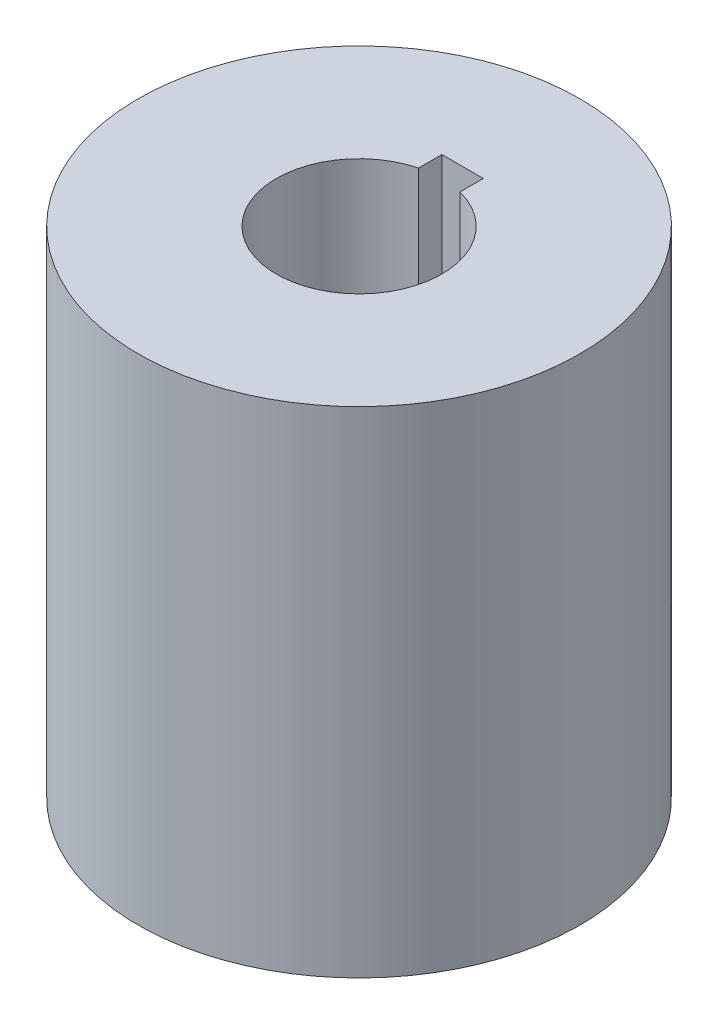
ISO-10303-21;
HEADER;
FILE_DESCRIPTION(('STEP AP214'),'2;1');
FILE_NAME('part.step','',(''),(''),'','','');
FILE_SCHEMA(('AUTOMOTIVE_DESIGN { 1 0 10303 214 1 1 1 1 }'));
ENDSEC;
DATA;
#1=APPLICATION_CONTEXT('core data for automotive mechanical design processes');
#2=APPLICATION_PROTOCOL_DEFINITION('international standard','automotive_design',2000,#1);
#3=PRODUCT_CONTEXT('',#1,'mechanical');
#4=PRODUCT('Part','Part','',(#3));
#5=PRODUCT_RELATED_PRODUCT_CATEGORY('part','',(#4));
#6=PRODUCT_DEFINITION_FORMATION('','',#4);
#7=PRODUCT_DEFINITION_CONTEXT('part definition',#1,'design');
#8=PRODUCT_DEFINITION('design','',#6,#7);
#9=PRODUCT_DEFINITION_SHAPE('','',#8);
#10=(LENGTH_UNIT() NAMED_UNIT(*) SI_UNIT(.MILLI.,.METRE.));
#11=(NAMED_UNIT(*) PLANE_ANGLE_UNIT() SI_UNIT($,.RADIAN.));
#12=(NAMED_UNIT(*) SI_UNIT($,.STERADIAN.) SOLID_ANGLE_UNIT());
#13=UNCERTAINTY_MEASURE_WITH_UNIT(LENGTH_MEASURE(1.E-05),#10,'distance_accuracy_value','');
#14=(GEOMETRIC_REPRESENTATION_CONTEXT(3) GLOBAL_UNCERTAINTY_ASSIGNED_CONTEXT((#13)) GLOBAL_UNIT_ASSIGNED_CONTEXT((#10,
#11,#12)) REPRESENTATION_CONTEXT('',''));
#15=CARTESIAN_POINT('',(0.,0.,0.));
#16=DIRECTION('',(0.,0.,1.));
#17=DIRECTION('',(1.,0.,0.));
#18=AXIS2_PLACEMENT_3D('',#15,#16,#17);
#19=CARTESIAN_POINT('',(1.190625,28.448,-5.953125));
#20=DIRECTION('',(-1.,0.,0.));
#21=DIRECTION('',(0.,0.,1.));
#22=AXIS2_PLACEMENT_3D('',#19,#20,#21);
#23=PLANE('',#22);
#24=DIRECTION('',(0.,0.,1.));
#25=VECTOR('',#24,1.);
#26=CARTESIAN_POINT('',(1.190625,28.448,-5.953125));
#27=LINE('',#26,#25);
#28=CARTESIAN_POINT('',(1.190625,28.448,-4.61127079657821));
#29=VERTEX_POINT('',#28);
#30=CARTESIAN_POINT('',(1.190625,28.448,-5.953125));
#31=VERTEX_POINT('',#30);
#32=EDGE_CURVE('E47',#29,#31,#27,.F.);
#33=ORIENTED_EDGE('',*,*,#32,.T.);
#34=DIRECTION('',(0.,1.,0.));
#35=VECTOR('',#34,1.);
#36=CARTESIAN_POINT('',(1.190625,28.448,-5.953125));
#37=LINE('',#36,#35);
#38=CARTESIAN_POINT('',(1.190625,0.,-5.953125));
#39=VERTEX_POINT('',#38);
#40=EDGE_CURVE('E74',#39,#31,#37,.T.);
#41=ORIENTED_EDGE('',*,*,#40,.F.);
#42=DIRECTION('',(0.,0.,1.));
#43=VECTOR('',#42,1.);
#44=CARTESIAN_POINT('',(1.190625,0.,-5.953125));
#45=LINE('',#44,#43);
#46=CARTESIAN_POINT('',(1.190625,0.,-4.61127079657821));
#47=VERTEX_POINT('',#46);
#48=EDGE_CURVE('E62',#39,#47,#45,.T.);
#49=ORIENTED_EDGE('',*,*,#48,.T.);
#50=DIRECTION('',(0.,-1.,0.));
#51=VECTOR('',#50,1.);
#52=CARTESIAN_POINT('',(1.190625,28.448,-4.61127079657821));
#53=LINE('',#52,#51);
#54=EDGE_CURVE('E166',#47,#29,#53,.F.);
#55=ORIENTED_EDGE('',*,*,#54,.T.);
#56=EDGE_LOOP('',(#33,#41,#49,#55));
#57=FACE_BOUND('',#56,.T.);
#58=ADVANCED_FACE('F17',(#57),#23,.T.);
#59=CARTESIAN_POINT('',(-1.190625,28.448,-5.953125));
#60=DIRECTION('',(1.,0.,0.));
#61=DIRECTION('',(0.,0.,-1.));
#62=AXIS2_PLACEMENT_3D('',#59,#60,#61);
#63=PLANE('',#62);
#64=DIRECTION('',(0.,0.,-1.));
#65=VECTOR('',#64,1.);
#66=CARTESIAN_POINT('',(-1.190625,28.448,-5.953125));
#67=LINE('',#66,#65);
#68=CARTESIAN_POINT('',(-1.190625,28.448,-5.953125));
#69=VERTEX_POINT('',#68);
#70=CARTESIAN_POINT('',(-1.190625,28.448,-4.61127079657821));
#71=VERTEX_POINT('',#70);
#72=EDGE_CURVE('E54',#69,#71,#67,.F.);
#73=ORIENTED_EDGE('',*,*,#72,.T.);
#74=DIRECTION('',(0.,-1.,0.));
#75=VECTOR('',#74,1.);
#76=CARTESIAN_POINT('',(-1.190625,28.448,-4.61127079657821));
#77=LINE('',#76,#75);
#78=CARTESIAN_POINT('',(-1.190625,0.,-4.61127079657821));
#79=VERTEX_POINT('',#78);
#80=EDGE_CURVE('E165',#71,#79,#77,.T.);
#81=ORIENTED_EDGE('',*,*,#80,.T.);
#82=DIRECTION('',(0.,0.,-1.));
#83=VECTOR('',#82,1.);
#84=CARTESIAN_POINT('',(-1.190625,0.,-5.953125));
#85=LINE('',#84,#83);
#86=CARTESIAN_POINT('',(-1.190625,0.,-5.953125));
#87=VERTEX_POINT('',#86);
#88=EDGE_CURVE('E35',#79,#87,#85,.T.);
#89=ORIENTED_EDGE('',*,*,#88,.T.);
#90=DIRECTION('',(0.,1.,0.));
#91=VECTOR('',#90,1.);
#92=CARTESIAN_POINT('',(-1.190625,28.448,-5.953125));
#93=LINE('',#92,#91);
#94=EDGE_CURVE('E77',#69,#87,#93,.F.);
#95=ORIENTED_EDGE('',*,*,#94,.F.);
#96=EDGE_LOOP('',(#73,#81,#89,#95));
#97=FACE_BOUND('',#96,.T.);
#98=ADVANCED_FACE('F142',(#97),#63,.T.);
#99=CARTESIAN_POINT('',(-1.190625,28.448,-5.953125));
#100=DIRECTION('',(0.,0.,1.));
#101=DIRECTION('',(1.,0.,0.));
#102=AXIS2_PLACEMENT_3D('',#99,#100,#101);
#103=PLANE('',#102);
#104=DIRECTION('',(1.,0.,0.));
#105=VECTOR('',#104,1.);
#106=CARTESIAN_POINT('',(0.,28.448,-5.953125));
#107=LINE('',#106,#105);
#108=EDGE_CURVE('E81',#69,#31,#107,.T.);
#109=ORIENTED_EDGE('',*,*,#108,.F.);
#110=ORIENTED_EDGE('',*,*,#94,.T.);
#111=DIRECTION('',(1.,0.,0.));
#112=VECTOR('',#111,1.);
#113=CARTESIAN_POINT('',(0.,0.,-5.953125));
#114=LINE('',#113,#112);
#115=EDGE_CURVE('E67',#87,#39,#114,.T.);
#116=ORIENTED_EDGE('',*,*,#115,.T.);
#117=ORIENTED_EDGE('',*,*,#40,.T.);
#118=EDGE_LOOP('',(#109,#110,#116,#117));
#119=FACE_BOUND('',#118,.T.);
#120=ADVANCED_FACE('F80',(#119),#103,.T.);
#121=CARTESIAN_POINT('',(0.,28.448,0.));
#122=DIRECTION('',(0.,-1.,0.));
#123=DIRECTION('',(0.,0.,-1.));
#124=AXIS2_PLACEMENT_3D('',#121,#122,#123);
#125=CYLINDRICAL_SURFACE('',#124,4.7625);
#126=ORIENTED_EDGE('',*,*,#80,.F.);
#127=CARTESIAN_POINT('',(0.,28.448,0.));
#128=DIRECTION('',(0.,-1.,0.));
#129=DIRECTION('',(0.,0.,-1.));
#130=AXIS2_PLACEMENT_3D('',#127,#128,#129);
#131=CIRCLE('',#130,4.7625);
#132=EDGE_CURVE('E20',#29,#71,#131,.T.);
#133=ORIENTED_EDGE('',*,*,#132,.F.);
#134=ORIENTED_EDGE('',*,*,#54,.F.);
#135=CARTESIAN_POINT('',(0.,0.,0.));
#136=DIRECTION('',(0.,-1.,0.));
#137=DIRECTION('',(0.,0.,-1.));
#138=AXIS2_PLACEMENT_3D('',#135,#136,#137);
#139=CIRCLE('',#138,4.7625);
#140=EDGE_CURVE('E69',#47,#79,#139,.T.);
#141=ORIENTED_EDGE('',*,*,#140,.T.);
#142=EDGE_LOOP('',(#126,#133,#134,#141));
#143=FACE_BOUND('',#142,.T.);
#144=ADVANCED_FACE('F98',(#143),#125,.F.);
#145=CARTESIAN_POINT('',(0.,28.448,0.));
#146=DIRECTION('',(0.,1.,0.));
#147=DIRECTION('',(0.,0.,1.));
#148=AXIS2_PLACEMENT_3D('',#145,#146,#147);
#149=PLANE('',#148);
#150=ORIENTED_EDGE('',*,*,#108,.T.);
#151=ORIENTED_EDGE('',*,*,#32,.F.);
#152=ORIENTED_EDGE('',*,*,#132,.T.);
#153=ORIENTED_EDGE('',*,*,#72,.F.);
#154=EDGE_LOOP('',(#150,#151,#152,#153));
#155=FACE_BOUND('',#154,.T.);
#156=CARTESIAN_POINT('',(0.,28.448,0.));
#157=DIRECTION('',(0.,-1.,0.));
#158=DIRECTION('',(0.,0.,-1.));
#159=AXIS2_PLACEMENT_3D('',#156,#157,#158);
#160=CIRCLE('',#159,12.7);
#161=CARTESIAN_POINT('',(0.,28.448,-12.7));
#162=VERTEX_POINT('',#161);
#163=EDGE_CURVE('E26',#162,#162,#160,.T.);
#164=ORIENTED_EDGE('',*,*,#163,.F.);
#165=EDGE_LOOP('',(#164));
#166=FACE_BOUND('',#165,.T.);
#167=ADVANCED_FACE('F96',(#155,#166),#149,.T.);
#168=CARTESIAN_POINT('',(0.,0.,0.));
#169=DIRECTION('',(0.,1.,0.));
#170=DIRECTION('',(0.,0.,1.));
#171=AXIS2_PLACEMENT_3D('',#168,#169,#170);
#172=PLANE('',#171);
#173=ORIENTED_EDGE('',*,*,#140,.F.);
#174=ORIENTED_EDGE('',*,*,#48,.F.);
#175=ORIENTED_EDGE('',*,*,#115,.F.);
#176=ORIENTED_EDGE('',*,*,#88,.F.);
#177=EDGE_LOOP('',(#173,#174,#175,#176));
#178=FACE_BOUND('',#177,.T.);
#179=CARTESIAN_POINT('',(0.,0.,0.));
#180=DIRECTION('',(0.,-1.,0.));
#181=DIRECTION('',(0.,0.,-1.));
#182=AXIS2_PLACEMENT_3D('',#179,#180,#181);
#183=CIRCLE('',#182,12.7);
#184=CARTESIAN_POINT('',(0.,0.,-12.7));
#185=VERTEX_POINT('',#184);
#186=EDGE_CURVE('E11',#185,#185,#183,.F.);
#187=ORIENTED_EDGE('',*,*,#186,.F.);
#188=EDGE_LOOP('',(#187));
#189=FACE_BOUND('',#188,.T.);
#190=ADVANCED_FACE('F64',(#178,#189),#172,.F.);
#191=CARTESIAN_POINT('',(0.,28.448,0.));
#192=DIRECTION('',(0.,-1.,0.));
#193=DIRECTION('',(0.,0.,-1.));
#194=AXIS2_PLACEMENT_3D('',#191,#192,#193);
#195=CYLINDRICAL_SURFACE('',#194,12.7);
#196=ORIENTED_EDGE('',*,*,#186,.T.);
#197=EDGE_LOOP('',(#196));
#198=FACE_BOUND('',#197,.T.);
#199=ORIENTED_EDGE('',*,*,#163,.T.);
#200=EDGE_LOOP('',(#199));
#201=FACE_BOUND('',#200,.T.);
#202=ADVANCED_FACE('F94',(#198,#201),#195,.T.);
#203=CLOSED_SHELL('',(#58,#98,#120,#144,#167,#190,#202));
#204=MANIFOLD_SOLID_BREP('B1',#203);
#205=ADVANCED_BREP_SHAPE_REPRESENTATION('',(#18,#204),#14);
#206=SHAPE_DEFINITION_REPRESENTATION(#9,#205);
ENDSEC;
END-ISO-10303-21;
